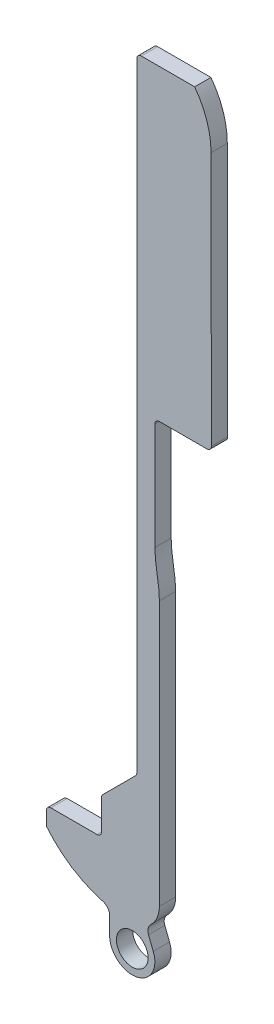
ISO-10303-21;
HEADER;
FILE_DESCRIPTION(('STEP AP214'),'2;1');
FILE_NAME('part.step','',(''),(''),'','','');
FILE_SCHEMA(('AUTOMOTIVE_DESIGN { 1 0 10303 214 1 1 1 1 }'));
ENDSEC;
DATA;
#1=APPLICATION_CONTEXT('core data for automotive mechanical design processes');
#2=APPLICATION_PROTOCOL_DEFINITION('international standard','automotive_design',2000,#1);
#3=PRODUCT_CONTEXT('',#1,'mechanical');
#4=PRODUCT('Part','Part','',(#3));
#5=PRODUCT_RELATED_PRODUCT_CATEGORY('part','',(#4));
#6=PRODUCT_DEFINITION_FORMATION('','',#4);
#7=PRODUCT_DEFINITION_CONTEXT('part definition',#1,'design');
#8=PRODUCT_DEFINITION('design','',#6,#7);
#9=PRODUCT_DEFINITION_SHAPE('','',#8);
#10=(LENGTH_UNIT() NAMED_UNIT(*) SI_UNIT(.MILLI.,.METRE.));
#11=(NAMED_UNIT(*) PLANE_ANGLE_UNIT() SI_UNIT($,.RADIAN.));
#12=(NAMED_UNIT(*) SI_UNIT($,.STERADIAN.) SOLID_ANGLE_UNIT());
#13=UNCERTAINTY_MEASURE_WITH_UNIT(LENGTH_MEASURE(1.E-05),#10,'distance_accuracy_value','');
#14=(GEOMETRIC_REPRESENTATION_CONTEXT(3) GLOBAL_UNCERTAINTY_ASSIGNED_CONTEXT((#13)) GLOBAL_UNIT_ASSIGNED_CONTEXT((#10,
#11,#12)) REPRESENTATION_CONTEXT('',''));
#15=CARTESIAN_POINT('',(0.,0.,0.));
#16=DIRECTION('',(0.,0.,1.));
#17=DIRECTION('',(1.,0.,0.));
#18=AXIS2_PLACEMENT_3D('',#15,#16,#17);
#19=CARTESIAN_POINT('',(9.43,12.1305444444445,1.8));
#20=DIRECTION('',(0.,0.,-1.));
#21=DIRECTION('',(-1.,0.,0.));
#22=AXIS2_PLACEMENT_3D('',#19,#20,#21);
#23=CYLINDRICAL_SURFACE('',#22,12.1305444444445);
#24=CARTESIAN_POINT('',(9.43,12.1305444444445,0.));
#25=DIRECTION('',(0.,0.,1.));
#26=DIRECTION('',(-1.,0.,0.));
#27=AXIS2_PLACEMENT_3D('',#24,#25,#26);
#28=CIRCLE('',#27,12.1305444444445);
#29=CARTESIAN_POINT('',(0.,4.5,0.));
#30=VERTEX_POINT('',#29);
#31=CARTESIAN_POINT('',(6.26122298389929,0.421190886673896,0.));
#32=VERTEX_POINT('',#31);
#33=EDGE_CURVE('E258',#30,#32,#28,.T.);
#34=ORIENTED_EDGE('',*,*,#33,.T.);
#35=DIRECTION('',(0.,0.,-1.));
#36=VECTOR('',#35,1.);
#37=CARTESIAN_POINT('',(6.26122298389929,0.421190886673894,1.8));
#38=LINE('',#37,#36);
#39=CARTESIAN_POINT('',(6.26122298389929,0.421190886673896,1.8));
#40=VERTEX_POINT('',#39);
#41=EDGE_CURVE('E346',#32,#40,#38,.F.);
#42=ORIENTED_EDGE('',*,*,#41,.T.);
#43=CARTESIAN_POINT('',(9.43,12.1305444444445,1.8));
#44=DIRECTION('',(0.,0.,1.));
#45=DIRECTION('',(-1.,0.,0.));
#46=AXIS2_PLACEMENT_3D('',#43,#44,#45);
#47=CIRCLE('',#46,12.1305444444445);
#48=CARTESIAN_POINT('',(0.,4.5,1.8));
#49=VERTEX_POINT('',#48);
#50=EDGE_CURVE('E260',#49,#40,#47,.T.);
#51=ORIENTED_EDGE('',*,*,#50,.F.);
#52=DIRECTION('',(0.,0.,-1.));
#53=VECTOR('',#52,1.);
#54=CARTESIAN_POINT('',(0.,4.5,1.8));
#55=LINE('',#54,#53);
#56=EDGE_CURVE('E477',#49,#30,#55,.T.);
#57=ORIENTED_EDGE('',*,*,#56,.T.);
#58=EDGE_LOOP('',(#34,#42,#51,#57));
#59=FACE_BOUND('',#58,.T.);
#60=ADVANCED_FACE('F41',(#59),#23,.T.);
#61=CARTESIAN_POINT('',(9.43,3.07,1.8));
#62=DIRECTION('',(0.,0.,-1.));
#63=DIRECTION('',(-1.,0.,0.));
#64=AXIS2_PLACEMENT_3D('',#61,#62,#63);
#65=CYLINDRICAL_SURFACE('',#64,3.07);
#66=CARTESIAN_POINT('',(9.43,3.07,1.8));
#67=DIRECTION('',(0.,0.,1.));
#68=DIRECTION('',(-1.,0.,0.));
#69=AXIS2_PLACEMENT_3D('',#66,#67,#68);
#70=CIRCLE('',#69,3.07);
#71=CARTESIAN_POINT('',(11.5409002213602,0.840874553673203,1.8));
#72=VERTEX_POINT('',#71);
#73=CARTESIAN_POINT('',(12.5,3.07,1.8));
#74=VERTEX_POINT('',#73);
#75=EDGE_CURVE('E263',#72,#74,#70,.T.);
#76=ORIENTED_EDGE('',*,*,#75,.F.);
#77=DIRECTION('',(0.,0.,-1.));
#78=VECTOR('',#77,1.);
#79=CARTESIAN_POINT('',(11.5409002213602,0.840874553673203,1.8));
#80=LINE('',#79,#78);
#81=CARTESIAN_POINT('',(11.5409002213602,0.840874553673203,0.));
#82=VERTEX_POINT('',#81);
#83=EDGE_CURVE('E358',#72,#82,#80,.T.);
#84=ORIENTED_EDGE('',*,*,#83,.T.);
#85=CARTESIAN_POINT('',(9.43,3.07,0.));
#86=DIRECTION('',(0.,0.,1.));
#87=DIRECTION('',(-1.,0.,0.));
#88=AXIS2_PLACEMENT_3D('',#85,#86,#87);
#89=CIRCLE('',#88,3.07);
#90=CARTESIAN_POINT('',(12.5,3.07,0.));
#91=VERTEX_POINT('',#90);
#92=EDGE_CURVE('E529',#82,#91,#89,.T.);
#93=ORIENTED_EDGE('',*,*,#92,.T.);
#94=DIRECTION('',(0.,0.,-1.));
#95=VECTOR('',#94,1.);
#96=CARTESIAN_POINT('',(12.5,3.07,1.8));
#97=LINE('',#96,#95);
#98=EDGE_CURVE('E457',#74,#91,#97,.T.);
#99=ORIENTED_EDGE('',*,*,#98,.F.);
#100=EDGE_LOOP('',(#76,#84,#93,#99));
#101=FACE_BOUND('',#100,.T.);
#102=ADVANCED_FACE('F292',(#101),#65,.T.);
#103=CARTESIAN_POINT('',(12.5,32.33,1.8));
#104=DIRECTION('',(-1.,0.,0.));
#105=DIRECTION('',(0.,-1.,0.));
#106=AXIS2_PLACEMENT_3D('',#103,#104,#105);
#107=PLANE('',#106);
#108=DIRECTION('',(0.,1.,0.));
#109=VECTOR('',#108,1.);
#110=CARTESIAN_POINT('',(12.5,32.33,0.));
#111=LINE('',#110,#109);
#112=CARTESIAN_POINT('',(12.5,32.33,0.));
#113=VERTEX_POINT('',#112);
#114=EDGE_CURVE('E523',#91,#113,#111,.T.);
#115=ORIENTED_EDGE('',*,*,#114,.T.);
#116=DIRECTION('',(0.,0.,-1.));
#117=VECTOR('',#116,1.);
#118=CARTESIAN_POINT('',(12.5,32.33,1.8));
#119=LINE('',#118,#117);
#120=CARTESIAN_POINT('',(12.5,32.33,1.8));
#121=VERTEX_POINT('',#120);
#122=EDGE_CURVE('E461',#121,#113,#119,.T.);
#123=ORIENTED_EDGE('',*,*,#122,.F.);
#124=DIRECTION('',(0.,1.,0.));
#125=VECTOR('',#124,1.);
#126=CARTESIAN_POINT('',(12.5,32.33,1.8));
#127=LINE('',#126,#125);
#128=EDGE_CURVE('E267',#74,#121,#127,.T.);
#129=ORIENTED_EDGE('',*,*,#128,.F.);
#130=ORIENTED_EDGE('',*,*,#98,.T.);
#131=EDGE_LOOP('',(#115,#123,#129,#130));
#132=FACE_BOUND('',#131,.T.);
#133=ADVANCED_FACE('F287',(#132),#107,.F.);
#134=CARTESIAN_POINT('',(12.5,32.33,1.8));
#135=CARTESIAN_POINT('',(12.5,33.9722823380889,1.8));
#136=CARTESIAN_POINT('',(12.,35.554764974261,1.8));
#137=CARTESIAN_POINT('',(12.,37.18,1.8));
#138=B_SPLINE_CURVE_WITH_KNOTS('',3,(#134,#135,#136,#137),.UNSPECIFIED.,.F.,.F.,(4,4),(0.,1.),.UNSPECIFIED.);
#139=DIRECTION('',(0.,0.,-1.));
#140=VECTOR('',#139,1.);
#141=SURFACE_OF_LINEAR_EXTRUSION('',#138,#140);
#142=CARTESIAN_POINT('',(12.5,32.33,0.));
#143=CARTESIAN_POINT('',(12.5,33.9722823380889,0.));
#144=CARTESIAN_POINT('',(12.,35.554764974261,0.));
#145=CARTESIAN_POINT('',(12.,37.18,0.));
#146=B_SPLINE_CURVE_WITH_KNOTS('',3,(#142,#143,#144,#145),.UNSPECIFIED.,.F.,.F.,(4,4),(0.,1.),.UNSPECIFIED.);
#147=CARTESIAN_POINT('',(12.,37.18,0.));
#148=VERTEX_POINT('',#147);
#149=EDGE_CURVE('E518',#113,#148,#146,.T.);
#150=ORIENTED_EDGE('',*,*,#149,.T.);
#151=DIRECTION('',(0.,0.,-1.));
#152=VECTOR('',#151,1.);
#153=CARTESIAN_POINT('',(12.,37.18,1.8));
#154=LINE('',#153,#152);
#155=CARTESIAN_POINT('',(12.,37.18,1.8));
#156=VERTEX_POINT('',#155);
#157=EDGE_CURVE('E465',#156,#148,#154,.T.);
#158=ORIENTED_EDGE('',*,*,#157,.F.);
#159=EDGE_CURVE('E270',#121,#156,#138,.T.);
#160=ORIENTED_EDGE('',*,*,#159,.F.);
#161=ORIENTED_EDGE('',*,*,#122,.T.);
#162=EDGE_LOOP('',(#150,#158,#160,#161));
#163=FACE_BOUND('',#162,.T.);
#164=ADVANCED_FACE('F282',(#163),#141,.F.);
#165=CARTESIAN_POINT('',(12.,49.5,1.8));
#166=DIRECTION('',(-1.,0.,0.));
#167=DIRECTION('',(0.,-1.,0.));
#168=AXIS2_PLACEMENT_3D('',#165,#166,#167);
#169=PLANE('',#168);
#170=DIRECTION('',(0.,1.,0.));
#171=VECTOR('',#170,1.);
#172=CARTESIAN_POINT('',(12.,49.5,0.));
#173=LINE('',#172,#171);
#174=CARTESIAN_POINT('',(12.,49.,0.));
#175=VERTEX_POINT('',#174);
#176=EDGE_CURVE('E514',#148,#175,#173,.T.);
#177=ORIENTED_EDGE('',*,*,#176,.T.);
#178=DIRECTION('',(0.,0.,-1.));
#179=VECTOR('',#178,1.);
#180=CARTESIAN_POINT('',(12.,49.,1.8));
#181=LINE('',#180,#179);
#182=CARTESIAN_POINT('',(12.,49.,1.8));
#183=VERTEX_POINT('',#182);
#184=EDGE_CURVE('E384',#175,#183,#181,.F.);
#185=ORIENTED_EDGE('',*,*,#184,.T.);
#186=DIRECTION('',(0.,1.,0.));
#187=VECTOR('',#186,1.);
#188=CARTESIAN_POINT('',(12.,49.5,1.8));
#189=LINE('',#188,#187);
#190=EDGE_CURVE('E276',#156,#183,#189,.T.);
#191=ORIENTED_EDGE('',*,*,#190,.F.);
#192=ORIENTED_EDGE('',*,*,#157,.T.);
#193=EDGE_LOOP('',(#177,#185,#191,#192));
#194=FACE_BOUND('',#193,.T.);
#195=ADVANCED_FACE('F286',(#194),#169,.F.);
#196=CARTESIAN_POINT('',(18.25,49.5,1.8));
#197=DIRECTION('',(0.,1.,0.));
#198=DIRECTION('',(0.,0.,1.));
#199=AXIS2_PLACEMENT_3D('',#196,#197,#198);
#200=PLANE('',#199);
#201=DIRECTION('',(1.,0.,0.));
#202=VECTOR('',#201,1.);
#203=CARTESIAN_POINT('',(18.25,49.5,0.));
#204=LINE('',#203,#202);
#205=CARTESIAN_POINT('',(12.5,49.5,0.));
#206=VERTEX_POINT('',#205);
#207=CARTESIAN_POINT('',(17.7493403583769,49.5,0.));
#208=VERTEX_POINT('',#207);
#209=EDGE_CURVE('E510',#206,#208,#204,.T.);
#210=ORIENTED_EDGE('',*,*,#209,.T.);
#211=DIRECTION('',(0.,0.,-1.));
#212=VECTOR('',#211,1.);
#213=CARTESIAN_POINT('',(17.7493403583769,49.5,1.8));
#214=LINE('',#213,#212);
#215=CARTESIAN_POINT('',(17.7493403583769,49.5,1.8));
#216=VERTEX_POINT('',#215);
#217=EDGE_CURVE('E390',#208,#216,#214,.F.);
#218=ORIENTED_EDGE('',*,*,#217,.T.);
#219=DIRECTION('',(1.,0.,0.));
#220=VECTOR('',#219,1.);
#221=CARTESIAN_POINT('',(18.25,49.5,1.8));
#222=LINE('',#221,#220);
#223=CARTESIAN_POINT('',(12.5,49.5,1.8));
#224=VERTEX_POINT('',#223);
#225=EDGE_CURVE('E561',#224,#216,#222,.T.);
#226=ORIENTED_EDGE('',*,*,#225,.F.);
#227=DIRECTION('',(0.,0.,-1.));
#228=VECTOR('',#227,1.);
#229=CARTESIAN_POINT('',(12.5,49.5,0.));
#230=LINE('',#229,#228);
#231=EDGE_CURVE('E393',#224,#206,#230,.T.);
#232=ORIENTED_EDGE('',*,*,#231,.T.);
#233=EDGE_LOOP('',(#210,#218,#226,#232));
#234=FACE_BOUND('',#233,.T.);
#235=ADVANCED_FACE('F577',(#234),#200,.F.);
#236=CARTESIAN_POINT('',(18.2122992950021,78.0954950668466,1.8));
#237=DIRECTION('',(-0.999999130893212,-0.00131841299280958,0.));
#238=DIRECTION('',(0.00131841299280959,-0.999999130893213,0.));
#239=AXIS2_PLACEMENT_3D('',#236,#237,#238);
#240=PLANE('',#239);
#241=DIRECTION('',(-0.00131841299280958,0.999999130893212,0.));
#242=VECTOR('',#241,1.);
#243=CARTESIAN_POINT('',(18.2122992950021,78.0954950668466,1.8));
#244=LINE('',#243,#242);
#245=CARTESIAN_POINT('',(18.2493399238235,50.0006592064964,1.8));
#246=VERTEX_POINT('',#245);
#247=CARTESIAN_POINT('',(18.2122992950021,78.0954950668466,1.8));
#248=VERTEX_POINT('',#247);
#249=EDGE_CURVE('E559',#246,#248,#244,.T.);
#250=ORIENTED_EDGE('',*,*,#249,.F.);
#251=DIRECTION('',(0.,0.,-1.));
#252=VECTOR('',#251,1.);
#253=CARTESIAN_POINT('',(18.2493399238235,50.0006592064964,1.8));
#254=LINE('',#253,#252);
#255=CARTESIAN_POINT('',(18.2493399238235,50.0006592064964,0.));
#256=VERTEX_POINT('',#255);
#257=EDGE_CURVE('E397',#246,#256,#254,.T.);
#258=ORIENTED_EDGE('',*,*,#257,.T.);
#259=DIRECTION('',(-0.00131841299280958,0.999999130893212,0.));
#260=VECTOR('',#259,1.);
#261=CARTESIAN_POINT('',(18.2122992950021,78.0954950668466,0.));
#262=LINE('',#261,#260);
#263=CARTESIAN_POINT('',(18.2122992950021,78.0954950668466,0.));
#264=VERTEX_POINT('',#263);
#265=EDGE_CURVE('E507',#256,#264,#262,.T.);
#266=ORIENTED_EDGE('',*,*,#265,.T.);
#267=DIRECTION('',(0.,0.,-1.));
#268=VECTOR('',#267,1.);
#269=CARTESIAN_POINT('',(18.2122992950021,78.0954950668466,1.8));
#270=LINE('',#269,#268);
#271=EDGE_CURVE('E469',#248,#264,#270,.T.);
#272=ORIENTED_EDGE('',*,*,#271,.F.);
#273=EDGE_LOOP('',(#250,#258,#266,#272));
#274=FACE_BOUND('',#273,.T.);
#275=ADVANCED_FACE('F586',(#274),#240,.F.);
#276=CARTESIAN_POINT('',(9.2123071169632,78.0836293499113,1.8));
#277=DIRECTION('',(0.,0.,-1.));
#278=DIRECTION('',(-1.,0.,0.));
#279=AXIS2_PLACEMENT_3D('',#276,#277,#278);
#280=CYLINDRICAL_SURFACE('',#279,9.);
#281=CARTESIAN_POINT('',(9.2123071169632,78.0836293499113,0.));
#282=DIRECTION('',(0.,0.,1.));
#283=DIRECTION('',(-1.,0.,0.));
#284=AXIS2_PLACEMENT_3D('',#281,#282,#283);
#285=CIRCLE('',#284,9.);
#286=CARTESIAN_POINT('',(16.4,83.5,0.));
#287=VERTEX_POINT('',#286);
#288=EDGE_CURVE('E504',#264,#287,#285,.T.);
#289=ORIENTED_EDGE('',*,*,#288,.T.);
#290=DIRECTION('',(0.,0.,-1.));
#291=VECTOR('',#290,1.);
#292=CARTESIAN_POINT('',(16.4,83.5,1.8));
#293=LINE('',#292,#291);
#294=CARTESIAN_POINT('',(16.4,83.5,1.8));
#295=VERTEX_POINT('',#294);
#296=EDGE_CURVE('E473',#295,#287,#293,.T.);
#297=ORIENTED_EDGE('',*,*,#296,.F.);
#298=CARTESIAN_POINT('',(9.2123071169632,78.0836293499113,1.8));
#299=DIRECTION('',(0.,0.,1.));
#300=DIRECTION('',(-1.,0.,0.));
#301=AXIS2_PLACEMENT_3D('',#298,#299,#300);
#302=CIRCLE('',#301,9.);
#303=EDGE_CURVE('E556',#248,#295,#302,.T.);
#304=ORIENTED_EDGE('',*,*,#303,.F.);
#305=ORIENTED_EDGE('',*,*,#271,.T.);
#306=EDGE_LOOP('',(#289,#297,#304,#305));
#307=FACE_BOUND('',#306,.T.);
#308=ADVANCED_FACE('F593',(#307),#280,.T.);
#309=CARTESIAN_POINT('',(10.,83.5,1.8));
#310=DIRECTION('',(0.,-1.,0.));
#311=DIRECTION('',(0.,0.,-1.));
#312=AXIS2_PLACEMENT_3D('',#309,#310,#311);
#313=PLANE('',#312);
#314=DIRECTION('',(-1.,0.,0.));
#315=VECTOR('',#314,1.);
#316=CARTESIAN_POINT('',(10.,83.5,0.));
#317=LINE('',#316,#315);
#318=CARTESIAN_POINT('',(10.5,83.5,0.));
#319=VERTEX_POINT('',#318);
#320=EDGE_CURVE('E500',#287,#319,#317,.T.);
#321=ORIENTED_EDGE('',*,*,#320,.T.);
#322=DIRECTION('',(0.,0.,-1.));
#323=VECTOR('',#322,1.);
#324=CARTESIAN_POINT('',(10.5,83.5,1.8));
#325=LINE('',#324,#323);
#326=CARTESIAN_POINT('',(10.5,83.5,1.8));
#327=VERTEX_POINT('',#326);
#328=EDGE_CURVE('E387',#319,#327,#325,.F.);
#329=ORIENTED_EDGE('',*,*,#328,.T.);
#330=DIRECTION('',(-1.,0.,0.));
#331=VECTOR('',#330,1.);
#332=CARTESIAN_POINT('',(10.,83.5,1.8));
#333=LINE('',#332,#331);
#334=EDGE_CURVE('E552',#295,#327,#333,.T.);
#335=ORIENTED_EDGE('',*,*,#334,.F.);
#336=ORIENTED_EDGE('',*,*,#296,.T.);
#337=EDGE_LOOP('',(#321,#329,#335,#336));
#338=FACE_BOUND('',#337,.T.);
#339=ADVANCED_FACE('F596',(#338),#313,.F.);
#340=CARTESIAN_POINT('',(10.,14.4,1.8));
#341=DIRECTION('',(1.,0.,0.));
#342=DIRECTION('',(0.,0.,-1.));
#343=AXIS2_PLACEMENT_3D('',#340,#341,#342);
#344=PLANE('',#343);
#345=DIRECTION('',(0.,-1.,0.));
#346=VECTOR('',#345,1.);
#347=CARTESIAN_POINT('',(10.,14.4,0.));
#348=LINE('',#347,#346);
#349=CARTESIAN_POINT('',(10.,83.,0.));
#350=VERTEX_POINT('',#349);
#351=CARTESIAN_POINT('',(10.,14.6071067811865,0.));
#352=VERTEX_POINT('',#351);
#353=EDGE_CURVE('E496',#350,#352,#348,.T.);
#354=ORIENTED_EDGE('',*,*,#353,.T.);
#355=DIRECTION('',(0.,0.,-1.));
#356=VECTOR('',#355,1.);
#357=CARTESIAN_POINT('',(10.,14.6071067811865,1.8));
#358=LINE('',#357,#356);
#359=CARTESIAN_POINT('',(10.,14.6071067811865,1.8));
#360=VERTEX_POINT('',#359);
#361=EDGE_CURVE('E401',#352,#360,#358,.F.);
#362=ORIENTED_EDGE('',*,*,#361,.T.);
#363=DIRECTION('',(0.,-1.,0.));
#364=VECTOR('',#363,1.);
#365=CARTESIAN_POINT('',(10.,14.4,1.8));
#366=LINE('',#365,#364);
#367=CARTESIAN_POINT('',(10.,83.,1.8));
#368=VERTEX_POINT('',#367);
#369=EDGE_CURVE('E548',#368,#360,#366,.T.);
#370=ORIENTED_EDGE('',*,*,#369,.F.);
#371=DIRECTION('',(0.,0.,-1.));
#372=VECTOR('',#371,1.);
#373=CARTESIAN_POINT('',(10.,83.,1.8));
#374=LINE('',#373,#372);
#375=EDGE_CURVE('E404',#368,#350,#374,.T.);
#376=ORIENTED_EDGE('',*,*,#375,.T.);
#377=EDGE_LOOP('',(#354,#362,#370,#376));
#378=FACE_BOUND('',#377,.T.);
#379=ADVANCED_FACE('F602',(#378),#344,.F.);
#380=CARTESIAN_POINT('',(6.1,10.5,1.8));
#381=DIRECTION('',(0.707106781186546,-0.707106781186549,0.));
#382=DIRECTION('',(0.707106781186549,0.707106781186546,0.));
#383=AXIS2_PLACEMENT_3D('',#380,#381,#382);
#384=PLANE('',#383);
#385=DIRECTION('',(-0.707106781186549,-0.707106781186546,0.));
#386=VECTOR('',#385,1.);
#387=CARTESIAN_POINT('',(6.1,10.5,0.));
#388=LINE('',#387,#386);
#389=CARTESIAN_POINT('',(9.85355339059327,14.2535533905933,0.));
#390=VERTEX_POINT('',#389);
#391=CARTESIAN_POINT('',(6.24644660940673,10.6464466094067,0.));
#392=VERTEX_POINT('',#391);
#393=EDGE_CURVE('E492',#390,#392,#388,.T.);
#394=ORIENTED_EDGE('',*,*,#393,.T.);
#395=DIRECTION('',(0.,0.,-1.));
#396=VECTOR('',#395,1.);
#397=CARTESIAN_POINT('',(6.24644660940673,10.6464466094067,1.8));
#398=LINE('',#397,#396);
#399=CARTESIAN_POINT('',(6.24644660940673,10.6464466094067,1.8));
#400=VERTEX_POINT('',#399);
#401=EDGE_CURVE('E408',#392,#400,#398,.F.);
#402=ORIENTED_EDGE('',*,*,#401,.T.);
#403=DIRECTION('',(-0.707106781186549,-0.707106781186546,0.));
#404=VECTOR('',#403,1.);
#405=CARTESIAN_POINT('',(6.1,10.5,1.8));
#406=LINE('',#405,#404);
#407=CARTESIAN_POINT('',(9.85355339059327,14.2535533905933,1.8));
#408=VERTEX_POINT('',#407);
#409=EDGE_CURVE('E544',#408,#400,#406,.T.);
#410=ORIENTED_EDGE('',*,*,#409,.F.);
#411=DIRECTION('',(0.,0.,-1.));
#412=VECTOR('',#411,1.);
#413=CARTESIAN_POINT('',(9.85355339059327,14.2535533905933,0.));
#414=LINE('',#413,#412);
#415=EDGE_CURVE('E411',#408,#390,#414,.T.);
#416=ORIENTED_EDGE('',*,*,#415,.T.);
#417=EDGE_LOOP('',(#394,#402,#410,#416));
#418=FACE_BOUND('',#417,.T.);
#419=ADVANCED_FACE('F609',(#418),#384,.F.);
#420=CARTESIAN_POINT('',(6.1,6.5,1.8));
#421=DIRECTION('',(1.,0.,0.));
#422=DIRECTION('',(0.,0.,-1.));
#423=AXIS2_PLACEMENT_3D('',#420,#421,#422);
#424=PLANE('',#423);
#425=DIRECTION('',(0.,-1.,0.));
#426=VECTOR('',#425,1.);
#427=CARTESIAN_POINT('',(6.1,6.5,0.));
#428=LINE('',#427,#426);
#429=CARTESIAN_POINT('',(6.1,10.2928932188135,0.));
#430=VERTEX_POINT('',#429);
#431=CARTESIAN_POINT('',(6.1,7.,0.));
#432=VERTEX_POINT('',#431);
#433=EDGE_CURVE('E488',#430,#432,#428,.T.);
#434=ORIENTED_EDGE('',*,*,#433,.T.);
#435=DIRECTION('',(0.,0.,-1.));
#436=VECTOR('',#435,1.);
#437=CARTESIAN_POINT('',(6.1,7.,1.8));
#438=LINE('',#437,#436);
#439=CARTESIAN_POINT('',(6.1,7.,1.8));
#440=VERTEX_POINT('',#439);
#441=EDGE_CURVE('E415',#432,#440,#438,.F.);
#442=ORIENTED_EDGE('',*,*,#441,.T.);
#443=DIRECTION('',(0.,-1.,0.));
#444=VECTOR('',#443,1.);
#445=CARTESIAN_POINT('',(6.1,6.5,1.8));
#446=LINE('',#445,#444);
#447=CARTESIAN_POINT('',(6.1,10.2928932188135,1.8));
#448=VERTEX_POINT('',#447);
#449=EDGE_CURVE('E540',#448,#440,#446,.T.);
#450=ORIENTED_EDGE('',*,*,#449,.F.);
#451=DIRECTION('',(0.,0.,-1.));
#452=VECTOR('',#451,1.);
#453=CARTESIAN_POINT('',(6.1,10.2928932188135,1.8));
#454=LINE('',#453,#452);
#455=EDGE_CURVE('E418',#448,#430,#454,.T.);
#456=ORIENTED_EDGE('',*,*,#455,.T.);
#457=EDGE_LOOP('',(#434,#442,#450,#456));
#458=FACE_BOUND('',#457,.T.);
#459=ADVANCED_FACE('F616',(#458),#424,.F.);
#460=CARTESIAN_POINT('',(0.,6.5,1.8));
#461=DIRECTION('',(0.,-1.,0.));
#462=DIRECTION('',(0.,0.,-1.));
#463=AXIS2_PLACEMENT_3D('',#460,#461,#462);
#464=PLANE('',#463);
#465=DIRECTION('',(-1.,0.,0.));
#466=VECTOR('',#465,1.);
#467=CARTESIAN_POINT('',(0.,6.5,0.));
#468=LINE('',#467,#466);
#469=CARTESIAN_POINT('',(5.6,6.5,0.));
#470=VERTEX_POINT('',#469);
#471=CARTESIAN_POINT('',(0.5,6.5,0.));
#472=VERTEX_POINT('',#471);
#473=EDGE_CURVE('E484',#470,#472,#468,.T.);
#474=ORIENTED_EDGE('',*,*,#473,.T.);
#475=DIRECTION('',(0.,0.,-1.));
#476=VECTOR('',#475,1.);
#477=CARTESIAN_POINT('',(0.5,6.5,1.8));
#478=LINE('',#477,#476);
#479=CARTESIAN_POINT('',(0.5,6.5,1.8));
#480=VERTEX_POINT('',#479);
#481=EDGE_CURVE('E434',#472,#480,#478,.F.);
#482=ORIENTED_EDGE('',*,*,#481,.T.);
#483=DIRECTION('',(-1.,0.,0.));
#484=VECTOR('',#483,1.);
#485=CARTESIAN_POINT('',(0.,6.5,1.8));
#486=LINE('',#485,#484);
#487=CARTESIAN_POINT('',(5.6,6.5,1.8));
#488=VERTEX_POINT('',#487);
#489=EDGE_CURVE('E536',#488,#480,#486,.T.);
#490=ORIENTED_EDGE('',*,*,#489,.F.);
#491=DIRECTION('',(0.,0.,-1.));
#492=VECTOR('',#491,1.);
#493=CARTESIAN_POINT('',(5.6,6.5,0.));
#494=LINE('',#493,#492);
#495=EDGE_CURVE('E437',#488,#470,#494,.T.);
#496=ORIENTED_EDGE('',*,*,#495,.T.);
#497=EDGE_LOOP('',(#474,#482,#490,#496));
#498=FACE_BOUND('',#497,.T.);
#499=ADVANCED_FACE('F623',(#498),#464,.F.);
#500=CARTESIAN_POINT('',(0.,4.5,1.8));
#501=DIRECTION('',(1.,0.,0.));
#502=DIRECTION('',(0.,0.,-1.));
#503=AXIS2_PLACEMENT_3D('',#500,#501,#502);
#504=PLANE('',#503);
#505=DIRECTION('',(0.,-1.,0.));
#506=VECTOR('',#505,1.);
#507=CARTESIAN_POINT('',(0.,4.5,1.8));
#508=LINE('',#507,#506);
#509=CARTESIAN_POINT('',(0.,6.,1.8));
#510=VERTEX_POINT('',#509);
#511=EDGE_CURVE('E481',#510,#49,#508,.T.);
#512=ORIENTED_EDGE('',*,*,#511,.F.);
#513=DIRECTION('',(0.,0.,-1.));
#514=VECTOR('',#513,1.);
#515=CARTESIAN_POINT('',(0.,6.,1.8));
#516=LINE('',#515,#514);
#517=CARTESIAN_POINT('',(0.,6.,0.));
#518=VERTEX_POINT('',#517);
#519=EDGE_CURVE('E453',#510,#518,#516,.T.);
#520=ORIENTED_EDGE('',*,*,#519,.T.);
#521=DIRECTION('',(0.,-1.,0.));
#522=VECTOR('',#521,1.);
#523=CARTESIAN_POINT('',(0.,4.5,0.));
#524=LINE('',#523,#522);
#525=EDGE_CURVE('E264',#518,#30,#524,.T.);
#526=ORIENTED_EDGE('',*,*,#525,.T.);
#527=ORIENTED_EDGE('',*,*,#56,.F.);
#528=EDGE_LOOP('',(#512,#520,#526,#527));
#529=FACE_BOUND('',#528,.T.);
#530=ADVANCED_FACE('F630',(#529),#504,.F.);
#531=CARTESIAN_POINT('',(9.43,12.1305444444445,1.8));
#532=DIRECTION('',(0.,0.,-1.));
#533=DIRECTION('',(-1.,0.,0.));
#534=AXIS2_PLACEMENT_3D('',#531,#532,#533);
#535=PLANE('',#534);
#536=ORIENTED_EDGE('',*,*,#50,.T.);
#537=CARTESIAN_POINT('',(6.,-0.544087597848967,1.8));
#538=DIRECTION('',(0.,0.,-1.));
#539=DIRECTION('',(-1.,0.,0.));
#540=AXIS2_PLACEMENT_3D('',#537,#538,#539);
#541=CIRCLE('',#540,1.);
#542=CARTESIAN_POINT('',(7.,-0.544087597848967,1.8));
#543=VERTEX_POINT('',#542);
#544=EDGE_CURVE('E350',#40,#543,#541,.T.);
#545=ORIENTED_EDGE('',*,*,#544,.T.);
#546=DIRECTION('',(0.,1.,0.));
#547=VECTOR('',#546,1.);
#548=CARTESIAN_POINT('',(7.,0.,1.8));
#549=LINE('',#548,#547);
#550=CARTESIAN_POINT('',(7.,-2.49983254115863,1.8));
#551=VERTEX_POINT('',#550);
#552=EDGE_CURVE('E221',#551,#543,#549,.T.);
#553=ORIENTED_EDGE('',*,*,#552,.F.);
#554=CARTESIAN_POINT('',(9.50000000000001,-2.49983254115863,1.8));
#555=DIRECTION('',(0.,0.,-1.));
#556=DIRECTION('',(-1.,0.,0.));
#557=AXIS2_PLACEMENT_3D('',#554,#555,#556);
#558=CIRCLE('',#557,2.5);
#559=CARTESIAN_POINT('',(11.8240453183332,-1.57852186699189,1.8));
#560=VERTEX_POINT('',#559);
#561=EDGE_CURVE('E220',#560,#551,#558,.T.);
#562=ORIENTED_EDGE('',*,*,#561,.F.);
#563=DIRECTION('',(0.368524269666694,-0.929618127333278,0.));
#564=VECTOR('',#563,1.);
#565=CARTESIAN_POINT('',(9.67743927925068,3.8363830671635,1.8));
#566=LINE('',#565,#564);
#567=CARTESIAN_POINT('',(11.2988717426784,-0.253749209911017,1.8));
#568=VERTEX_POINT('',#567);
#569=EDGE_CURVE('E211',#568,#560,#566,.T.);
#570=ORIENTED_EDGE('',*,*,#569,.F.);
#571=CARTESIAN_POINT('',(12.2284898700117,0.114775059755678,1.8));
#572=DIRECTION('',(0.,0.,-1.));
#573=DIRECTION('',(-1.,0.,0.));
#574=AXIS2_PLACEMENT_3D('',#571,#572,#573);
#575=CIRCLE('',#574,1.);
#576=EDGE_CURVE('E11',#568,#72,#575,.T.);
#577=ORIENTED_EDGE('',*,*,#576,.T.);
#578=ORIENTED_EDGE('',*,*,#75,.T.);
#579=ORIENTED_EDGE('',*,*,#128,.T.);
#580=ORIENTED_EDGE('',*,*,#159,.T.);
#581=ORIENTED_EDGE('',*,*,#190,.T.);
#582=CARTESIAN_POINT('',(12.5,49.,1.8));
#583=DIRECTION('',(0.,0.,-1.));
#584=DIRECTION('',(-1.,0.,0.));
#585=AXIS2_PLACEMENT_3D('',#582,#583,#584);
#586=CIRCLE('',#585,0.5);
#587=EDGE_CURVE('E366',#183,#224,#586,.T.);
#588=ORIENTED_EDGE('',*,*,#587,.T.);
#589=ORIENTED_EDGE('',*,*,#225,.T.);
#590=CARTESIAN_POINT('',(17.7493403583769,50.,1.8));
#591=DIRECTION('',(0.,0.,-1.));
#592=DIRECTION('',(-1.,0.,0.));
#593=AXIS2_PLACEMENT_3D('',#590,#591,#592);
#594=CIRCLE('',#593,0.5);
#595=EDGE_CURVE('E428',#216,#246,#594,.F.);
#596=ORIENTED_EDGE('',*,*,#595,.T.);
#597=ORIENTED_EDGE('',*,*,#249,.T.);
#598=ORIENTED_EDGE('',*,*,#303,.T.);
#599=ORIENTED_EDGE('',*,*,#334,.T.);
#600=CARTESIAN_POINT('',(10.5,83.,1.8));
#601=DIRECTION('',(0.,0.,-1.));
#602=DIRECTION('',(-1.,0.,0.));
#603=AXIS2_PLACEMENT_3D('',#600,#601,#602);
#604=CIRCLE('',#603,0.5);
#605=EDGE_CURVE('E431',#327,#368,#604,.F.);
#606=ORIENTED_EDGE('',*,*,#605,.T.);
#607=ORIENTED_EDGE('',*,*,#369,.T.);
#608=CARTESIAN_POINT('',(9.5,14.6071067811865,1.8));
#609=DIRECTION('',(0.,0.,-1.));
#610=DIRECTION('',(-1.,0.,0.));
#611=AXIS2_PLACEMENT_3D('',#608,#609,#610);
#612=CIRCLE('',#611,0.5);
#613=EDGE_CURVE('E372',#360,#408,#612,.T.);
#614=ORIENTED_EDGE('',*,*,#613,.T.);
#615=ORIENTED_EDGE('',*,*,#409,.T.);
#616=CARTESIAN_POINT('',(6.6,10.2928932188135,1.8));
#617=DIRECTION('',(0.,0.,-1.));
#618=DIRECTION('',(-1.,0.,0.));
#619=AXIS2_PLACEMENT_3D('',#616,#617,#618);
#620=CIRCLE('',#619,0.5);
#621=EDGE_CURVE('E425',#400,#448,#620,.F.);
#622=ORIENTED_EDGE('',*,*,#621,.T.);
#623=ORIENTED_EDGE('',*,*,#449,.T.);
#624=CARTESIAN_POINT('',(5.6,7.,1.8));
#625=DIRECTION('',(0.,0.,-1.));
#626=DIRECTION('',(-1.,0.,0.));
#627=AXIS2_PLACEMENT_3D('',#624,#625,#626);
#628=CIRCLE('',#627,0.5);
#629=EDGE_CURVE('E378',#440,#488,#628,.T.);
#630=ORIENTED_EDGE('',*,*,#629,.T.);
#631=ORIENTED_EDGE('',*,*,#489,.T.);
#632=CARTESIAN_POINT('',(0.5,6.,1.8));
#633=DIRECTION('',(0.,0.,-1.));
#634=DIRECTION('',(-1.,0.,0.));
#635=AXIS2_PLACEMENT_3D('',#632,#633,#634);
#636=CIRCLE('',#635,0.5);
#637=EDGE_CURVE('E422',#480,#510,#636,.F.);
#638=ORIENTED_EDGE('',*,*,#637,.T.);
#639=ORIENTED_EDGE('',*,*,#511,.T.);
#640=EDGE_LOOP('',(#536,#545,#553,#562,#570,#577,#578,#579,#580,#581,#588,#589,#596,#597,#598,
#599,#606,#607,#614,#615,#622,#623,#630,#631,#638,#639));
#641=FACE_BOUND('',#640,.T.);
#642=CARTESIAN_POINT('',(9.50000000000001,-2.49983254115863,1.8));
#643=DIRECTION('',(0.,0.,-1.));
#644=DIRECTION('',(-1.,0.,0.));
#645=AXIS2_PLACEMENT_3D('',#642,#643,#644);
#646=CIRCLE('',#645,1.75);
#647=CARTESIAN_POINT('',(7.75000000000001,-2.49983254115863,1.8));
#648=VERTEX_POINT('',#647);
#649=EDGE_CURVE('E230',#648,#648,#646,.T.);
#650=ORIENTED_EDGE('',*,*,#649,.T.);
#651=EDGE_LOOP('',(#650));
#652=FACE_BOUND('',#651,.T.);
#653=ADVANCED_FACE('F234',(#641,#652),#535,.F.);
#654=CARTESIAN_POINT('',(9.43,12.1305444444445,0.));
#655=DIRECTION('',(0.,0.,-1.));
#656=DIRECTION('',(-1.,0.,0.));
#657=AXIS2_PLACEMENT_3D('',#654,#655,#656);
#658=PLANE('',#657);
#659=ORIENTED_EDGE('',*,*,#92,.F.);
#660=CARTESIAN_POINT('',(12.2284898700117,0.114775059755678,0.));
#661=DIRECTION('',(0.,0.,-1.));
#662=DIRECTION('',(-1.,0.,0.));
#663=AXIS2_PLACEMENT_3D('',#660,#661,#662);
#664=CIRCLE('',#663,1.);
#665=CARTESIAN_POINT('',(11.2988717426784,-0.253749209911017,0.));
#666=VERTEX_POINT('',#665);
#667=EDGE_CURVE('E50',#82,#666,#664,.F.);
#668=ORIENTED_EDGE('',*,*,#667,.T.);
#669=DIRECTION('',(0.368524269666694,-0.929618127333278,0.));
#670=VECTOR('',#669,1.);
#671=CARTESIAN_POINT('',(9.67743927925068,3.8363830671635,0.));
#672=LINE('',#671,#670);
#673=CARTESIAN_POINT('',(11.8240453183332,-1.57852186699189,0.));
#674=VERTEX_POINT('',#673);
#675=EDGE_CURVE('E248',#666,#674,#672,.T.);
#676=ORIENTED_EDGE('',*,*,#675,.T.);
#677=CARTESIAN_POINT('',(9.50000000000001,-2.49983254115863,0.));
#678=DIRECTION('',(0.,0.,-1.));
#679=DIRECTION('',(-1.,0.,0.));
#680=AXIS2_PLACEMENT_3D('',#677,#678,#679);
#681=CIRCLE('',#680,2.5);
#682=CARTESIAN_POINT('',(7.,-2.49983254115863,0.));
#683=VERTEX_POINT('',#682);
#684=EDGE_CURVE('E227',#674,#683,#681,.T.);
#685=ORIENTED_EDGE('',*,*,#684,.T.);
#686=DIRECTION('',(0.,1.,0.));
#687=VECTOR('',#686,1.);
#688=CARTESIAN_POINT('',(7.,0.,0.));
#689=LINE('',#688,#687);
#690=CARTESIAN_POINT('',(7.,-0.544087597848967,0.));
#691=VERTEX_POINT('',#690);
#692=EDGE_CURVE('E244',#683,#691,#689,.T.);
#693=ORIENTED_EDGE('',*,*,#692,.T.);
#694=CARTESIAN_POINT('',(6.,-0.544087597848967,0.));
#695=DIRECTION('',(0.,0.,-1.));
#696=DIRECTION('',(-1.,0.,0.));
#697=AXIS2_PLACEMENT_3D('',#694,#695,#696);
#698=CIRCLE('',#697,1.);
#699=EDGE_CURVE('E343',#691,#32,#698,.F.);
#700=ORIENTED_EDGE('',*,*,#699,.T.);
#701=ORIENTED_EDGE('',*,*,#33,.F.);
#702=ORIENTED_EDGE('',*,*,#525,.F.);
#703=CARTESIAN_POINT('',(0.5,6.,0.));
#704=DIRECTION('',(0.,0.,-1.));
#705=DIRECTION('',(-1.,0.,0.));
#706=AXIS2_PLACEMENT_3D('',#703,#704,#705);
#707=CIRCLE('',#706,0.5);
#708=EDGE_CURVE('E441',#518,#472,#707,.T.);
#709=ORIENTED_EDGE('',*,*,#708,.T.);
#710=ORIENTED_EDGE('',*,*,#473,.F.);
#711=CARTESIAN_POINT('',(5.6,7.,0.));
#712=DIRECTION('',(0.,0.,-1.));
#713=DIRECTION('',(-1.,0.,0.));
#714=AXIS2_PLACEMENT_3D('',#711,#712,#713);
#715=CIRCLE('',#714,0.5);
#716=EDGE_CURVE('E381',#470,#432,#715,.F.);
#717=ORIENTED_EDGE('',*,*,#716,.T.);
#718=ORIENTED_EDGE('',*,*,#433,.F.);
#719=CARTESIAN_POINT('',(6.6,10.2928932188135,0.));
#720=DIRECTION('',(0.,0.,-1.));
#721=DIRECTION('',(-1.,0.,0.));
#722=AXIS2_PLACEMENT_3D('',#719,#720,#721);
#723=CIRCLE('',#722,0.5);
#724=EDGE_CURVE('E444',#430,#392,#723,.T.);
#725=ORIENTED_EDGE('',*,*,#724,.T.);
#726=ORIENTED_EDGE('',*,*,#393,.F.);
#727=CARTESIAN_POINT('',(9.5,14.6071067811865,0.));
#728=DIRECTION('',(0.,0.,-1.));
#729=DIRECTION('',(-1.,0.,0.));
#730=AXIS2_PLACEMENT_3D('',#727,#728,#729);
#731=CIRCLE('',#730,0.5);
#732=EDGE_CURVE('E375',#390,#352,#731,.F.);
#733=ORIENTED_EDGE('',*,*,#732,.T.);
#734=ORIENTED_EDGE('',*,*,#353,.F.);
#735=CARTESIAN_POINT('',(10.5,83.,0.));
#736=DIRECTION('',(0.,0.,-1.));
#737=DIRECTION('',(-1.,0.,0.));
#738=AXIS2_PLACEMENT_3D('',#735,#736,#737);
#739=CIRCLE('',#738,0.5);
#740=EDGE_CURVE('E450',#350,#319,#739,.T.);
#741=ORIENTED_EDGE('',*,*,#740,.T.);
#742=ORIENTED_EDGE('',*,*,#320,.F.);
#743=ORIENTED_EDGE('',*,*,#288,.F.);
#744=ORIENTED_EDGE('',*,*,#265,.F.);
#745=CARTESIAN_POINT('',(17.7493403583769,50.,0.));
#746=DIRECTION('',(0.,0.,-1.));
#747=DIRECTION('',(-1.,0.,0.));
#748=AXIS2_PLACEMENT_3D('',#745,#746,#747);
#749=CIRCLE('',#748,0.5);
#750=EDGE_CURVE('E447',#256,#208,#749,.T.);
#751=ORIENTED_EDGE('',*,*,#750,.T.);
#752=ORIENTED_EDGE('',*,*,#209,.F.);
#753=CARTESIAN_POINT('',(12.5,49.,0.));
#754=DIRECTION('',(0.,0.,-1.));
#755=DIRECTION('',(-1.,0.,0.));
#756=AXIS2_PLACEMENT_3D('',#753,#754,#755);
#757=CIRCLE('',#756,0.5);
#758=EDGE_CURVE('E369',#206,#175,#757,.F.);
#759=ORIENTED_EDGE('',*,*,#758,.T.);
#760=ORIENTED_EDGE('',*,*,#176,.F.);
#761=ORIENTED_EDGE('',*,*,#149,.F.);
#762=ORIENTED_EDGE('',*,*,#114,.F.);
#763=EDGE_LOOP('',(#659,#668,#676,#685,#693,#700,#701,#702,#709,#710,#717,#718,#725,#726,#733,
#734,#741,#742,#743,#744,#751,#752,#759,#760,#761,#762));
#764=FACE_BOUND('',#763,.T.);
#765=CARTESIAN_POINT('',(9.50000000000001,-2.49983254115863,0.));
#766=DIRECTION('',(0.,0.,-1.));
#767=DIRECTION('',(-1.,0.,0.));
#768=AXIS2_PLACEMENT_3D('',#765,#766,#767);
#769=CIRCLE('',#768,1.75);
#770=CARTESIAN_POINT('',(7.75000000000001,-2.49983254115863,0.));
#771=VERTEX_POINT('',#770);
#772=EDGE_CURVE('E253',#771,#771,#769,.T.);
#773=ORIENTED_EDGE('',*,*,#772,.F.);
#774=EDGE_LOOP('',(#773));
#775=FACE_BOUND('',#774,.T.);
#776=ADVANCED_FACE('F304',(#764,#775),#658,.T.);
#777=CARTESIAN_POINT('',(0.5,6.,1.8));
#778=DIRECTION('',(0.,0.,-1.));
#779=DIRECTION('',(-1.,0.,0.));
#780=AXIS2_PLACEMENT_3D('',#777,#778,#779);
#781=CYLINDRICAL_SURFACE('',#780,0.5);
#782=ORIENTED_EDGE('',*,*,#637,.F.);
#783=ORIENTED_EDGE('',*,*,#481,.F.);
#784=ORIENTED_EDGE('',*,*,#708,.F.);
#785=ORIENTED_EDGE('',*,*,#519,.F.);
#786=EDGE_LOOP('',(#782,#783,#784,#785));
#787=FACE_BOUND('',#786,.T.);
#788=ADVANCED_FACE('F300',(#787),#781,.T.);
#789=CARTESIAN_POINT('',(5.6,7.,1.8));
#790=DIRECTION('',(0.,0.,1.));
#791=DIRECTION('',(1.,0.,0.));
#792=AXIS2_PLACEMENT_3D('',#789,#790,#791);
#793=CYLINDRICAL_SURFACE('',#792,0.5);
#794=ORIENTED_EDGE('',*,*,#629,.F.);
#795=ORIENTED_EDGE('',*,*,#441,.F.);
#796=ORIENTED_EDGE('',*,*,#716,.F.);
#797=ORIENTED_EDGE('',*,*,#495,.F.);
#798=EDGE_LOOP('',(#794,#795,#796,#797));
#799=FACE_BOUND('',#798,.T.);
#800=ADVANCED_FACE('F303',(#799),#793,.F.);
#801=CARTESIAN_POINT('',(6.6,10.2928932188135,1.8));
#802=DIRECTION('',(0.,0.,-1.));
#803=DIRECTION('',(-1.,0.,0.));
#804=AXIS2_PLACEMENT_3D('',#801,#802,#803);
#805=CYLINDRICAL_SURFACE('',#804,0.5);
#806=ORIENTED_EDGE('',*,*,#621,.F.);
#807=ORIENTED_EDGE('',*,*,#401,.F.);
#808=ORIENTED_EDGE('',*,*,#724,.F.);
#809=ORIENTED_EDGE('',*,*,#455,.F.);
#810=EDGE_LOOP('',(#806,#807,#808,#809));
#811=FACE_BOUND('',#810,.T.);
#812=ADVANCED_FACE('F308',(#811),#805,.T.);
#813=CARTESIAN_POINT('',(9.5,14.6071067811865,1.8));
#814=DIRECTION('',(0.,0.,1.));
#815=DIRECTION('',(1.,0.,0.));
#816=AXIS2_PLACEMENT_3D('',#813,#814,#815);
#817=CYLINDRICAL_SURFACE('',#816,0.5);
#818=ORIENTED_EDGE('',*,*,#613,.F.);
#819=ORIENTED_EDGE('',*,*,#361,.F.);
#820=ORIENTED_EDGE('',*,*,#732,.F.);
#821=ORIENTED_EDGE('',*,*,#415,.F.);
#822=EDGE_LOOP('',(#818,#819,#820,#821));
#823=FACE_BOUND('',#822,.T.);
#824=ADVANCED_FACE('F312',(#823),#817,.F.);
#825=CARTESIAN_POINT('',(17.7493403583769,50.,1.8));
#826=DIRECTION('',(0.,0.,-1.));
#827=DIRECTION('',(-1.,0.,0.));
#828=AXIS2_PLACEMENT_3D('',#825,#826,#827);
#829=CYLINDRICAL_SURFACE('',#828,0.5);
#830=ORIENTED_EDGE('',*,*,#595,.F.);
#831=ORIENTED_EDGE('',*,*,#217,.F.);
#832=ORIENTED_EDGE('',*,*,#750,.F.);
#833=ORIENTED_EDGE('',*,*,#257,.F.);
#834=EDGE_LOOP('',(#830,#831,#832,#833));
#835=FACE_BOUND('',#834,.T.);
#836=ADVANCED_FACE('F316',(#835),#829,.T.);
#837=CARTESIAN_POINT('',(10.5,83.,1.8));
#838=DIRECTION('',(0.,0.,-1.));
#839=DIRECTION('',(-1.,0.,0.));
#840=AXIS2_PLACEMENT_3D('',#837,#838,#839);
#841=CYLINDRICAL_SURFACE('',#840,0.5);
#842=ORIENTED_EDGE('',*,*,#605,.F.);
#843=ORIENTED_EDGE('',*,*,#328,.F.);
#844=ORIENTED_EDGE('',*,*,#740,.F.);
#845=ORIENTED_EDGE('',*,*,#375,.F.);
#846=EDGE_LOOP('',(#842,#843,#844,#845));
#847=FACE_BOUND('',#846,.T.);
#848=ADVANCED_FACE('F320',(#847),#841,.T.);
#849=CARTESIAN_POINT('',(12.5,49.,1.8));
#850=DIRECTION('',(0.,0.,1.));
#851=DIRECTION('',(1.,0.,0.));
#852=AXIS2_PLACEMENT_3D('',#849,#850,#851);
#853=CYLINDRICAL_SURFACE('',#852,0.5);
#854=ORIENTED_EDGE('',*,*,#587,.F.);
#855=ORIENTED_EDGE('',*,*,#184,.F.);
#856=ORIENTED_EDGE('',*,*,#758,.F.);
#857=ORIENTED_EDGE('',*,*,#231,.F.);
#858=EDGE_LOOP('',(#854,#855,#856,#857));
#859=FACE_BOUND('',#858,.T.);
#860=ADVANCED_FACE('F324',(#859),#853,.F.);
#861=CARTESIAN_POINT('',(7.,0.,1.8));
#862=DIRECTION('',(-1.,0.,0.));
#863=DIRECTION('',(0.,0.,1.));
#864=AXIS2_PLACEMENT_3D('',#861,#862,#863);
#865=PLANE('',#864);
#866=ORIENTED_EDGE('',*,*,#552,.T.);
#867=DIRECTION('',(0.,0.,-1.));
#868=VECTOR('',#867,1.);
#869=CARTESIAN_POINT('',(7.,-0.544087597848967,1.8));
#870=LINE('',#869,#868);
#871=EDGE_CURVE('E344',#543,#691,#870,.T.);
#872=ORIENTED_EDGE('',*,*,#871,.T.);
#873=ORIENTED_EDGE('',*,*,#692,.F.);
#874=DIRECTION('',(0.,0.,-1.));
#875=VECTOR('',#874,1.);
#876=CARTESIAN_POINT('',(7.,-2.49983254115863,1.8));
#877=LINE('',#876,#875);
#878=EDGE_CURVE('E229',#551,#683,#877,.T.);
#879=ORIENTED_EDGE('',*,*,#878,.F.);
#880=EDGE_LOOP('',(#866,#872,#873,#879));
#881=FACE_BOUND('',#880,.T.);
#882=ADVANCED_FACE('F327',(#881),#865,.T.);
#883=CARTESIAN_POINT('',(9.67743927925068,3.8363830671635,1.8));
#884=DIRECTION('',(0.929618127333278,0.368524269666694,0.));
#885=DIRECTION('',(-0.368524269666694,0.929618127333278,0.));
#886=AXIS2_PLACEMENT_3D('',#883,#884,#885);
#887=PLANE('',#886);
#888=ORIENTED_EDGE('',*,*,#675,.F.);
#889=DIRECTION('',(0.,0.,-1.));
#890=VECTOR('',#889,1.);
#891=CARTESIAN_POINT('',(11.2988717426784,-0.253749209911017,1.8));
#892=LINE('',#891,#890);
#893=EDGE_CURVE('E63',#666,#568,#892,.F.);
#894=ORIENTED_EDGE('',*,*,#893,.T.);
#895=ORIENTED_EDGE('',*,*,#569,.T.);
#896=DIRECTION('',(0.,0.,-1.));
#897=VECTOR('',#896,1.);
#898=CARTESIAN_POINT('',(11.8240453183332,-1.57852186699189,1.8));
#899=LINE('',#898,#897);
#900=EDGE_CURVE('E214',#560,#674,#899,.T.);
#901=ORIENTED_EDGE('',*,*,#900,.T.);
#902=EDGE_LOOP('',(#888,#894,#895,#901));
#903=FACE_BOUND('',#902,.T.);
#904=ADVANCED_FACE('F213',(#903),#887,.T.);
#905=CARTESIAN_POINT('',(9.50000000000001,-2.49983254115863,1.8));
#906=DIRECTION('',(0.,0.,-1.));
#907=DIRECTION('',(-1.,0.,0.));
#908=AXIS2_PLACEMENT_3D('',#905,#906,#907);
#909=CYLINDRICAL_SURFACE('',#908,2.5);
#910=ORIENTED_EDGE('',*,*,#684,.F.);
#911=ORIENTED_EDGE('',*,*,#900,.F.);
#912=ORIENTED_EDGE('',*,*,#561,.T.);
#913=ORIENTED_EDGE('',*,*,#878,.T.);
#914=EDGE_LOOP('',(#910,#911,#912,#913));
#915=FACE_BOUND('',#914,.T.);
#916=ADVANCED_FACE('F225',(#915),#909,.T.);
#917=CARTESIAN_POINT('',(9.50000000000001,-2.49983254115863,1.8));
#918=DIRECTION('',(0.,0.,-1.));
#919=DIRECTION('',(-1.,0.,0.));
#920=AXIS2_PLACEMENT_3D('',#917,#918,#919);
#921=CYLINDRICAL_SURFACE('',#920,1.75);
#922=ORIENTED_EDGE('',*,*,#649,.F.);
#923=EDGE_LOOP('',(#922));
#924=FACE_BOUND('',#923,.T.);
#925=ORIENTED_EDGE('',*,*,#772,.T.);
#926=EDGE_LOOP('',(#925));
#927=FACE_BOUND('',#926,.T.);
#928=ADVANCED_FACE('F331',(#924,#927),#921,.F.);
#929=CARTESIAN_POINT('',(6.,-0.544087597848967,1.8));
#930=DIRECTION('',(0.,0.,-1.));
#931=DIRECTION('',(-1.,0.,0.));
#932=AXIS2_PLACEMENT_3D('',#929,#930,#931);
#933=CYLINDRICAL_SURFACE('',#932,1.);
#934=ORIENTED_EDGE('',*,*,#699,.F.);
#935=ORIENTED_EDGE('',*,*,#871,.F.);
#936=ORIENTED_EDGE('',*,*,#544,.F.);
#937=ORIENTED_EDGE('',*,*,#41,.F.);
#938=EDGE_LOOP('',(#934,#935,#936,#937));
#939=FACE_BOUND('',#938,.T.);
#940=ADVANCED_FACE('F329',(#939),#933,.F.);
#941=CARTESIAN_POINT('',(12.2284898700117,0.114775059755678,1.8));
#942=DIRECTION('',(0.,0.,-1.));
#943=DIRECTION('',(-1.,0.,0.));
#944=AXIS2_PLACEMENT_3D('',#941,#942,#943);
#945=CYLINDRICAL_SURFACE('',#944,1.);
#946=ORIENTED_EDGE('',*,*,#576,.F.);
#947=ORIENTED_EDGE('',*,*,#893,.F.);
#948=ORIENTED_EDGE('',*,*,#667,.F.);
#949=ORIENTED_EDGE('',*,*,#83,.F.);
#950=EDGE_LOOP('',(#946,#947,#948,#949));
#951=FACE_BOUND('',#950,.T.);
#952=ADVANCED_FACE('F43',(#951),#945,.F.);
#953=CLOSED_SHELL('',(#60,#102,#133,#164,#195,#235,#275,#308,#339,#379,#419,#459,#499,#530,#653,
#776,#788,#800,#812,#824,#836,#848,#860,#882,#904,#916,#928,#940,#952));
#954=MANIFOLD_SOLID_BREP('B2',#953);
#955=ADVANCED_BREP_SHAPE_REPRESENTATION('',(#18,#954),#14);
#956=SHAPE_DEFINITION_REPRESENTATION(#9,#955);
ENDSEC;
END-ISO-10303-21;
